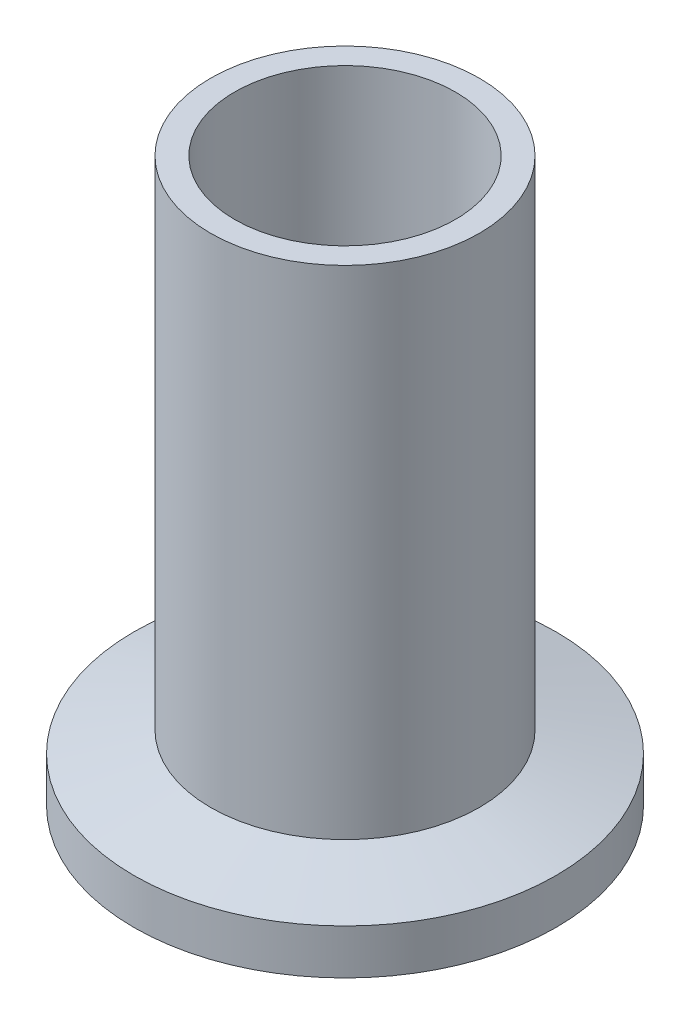
ISO-10303-21;
HEADER;
FILE_DESCRIPTION(('STEP AP214'),'2;1');
FILE_NAME('part.step','',(''),(''),'','','');
FILE_SCHEMA(('AUTOMOTIVE_DESIGN { 1 0 10303 214 1 1 1 1 }'));
ENDSEC;
DATA;
#1=APPLICATION_CONTEXT('core data for automotive mechanical design processes');
#2=APPLICATION_PROTOCOL_DEFINITION('international standard','automotive_design',2000,#1);
#3=PRODUCT_CONTEXT('',#1,'mechanical');
#4=PRODUCT('Part','Part','',(#3));
#5=PRODUCT_RELATED_PRODUCT_CATEGORY('part','',(#4));
#6=PRODUCT_DEFINITION_FORMATION('','',#4);
#7=PRODUCT_DEFINITION_CONTEXT('part definition',#1,'design');
#8=PRODUCT_DEFINITION('design','',#6,#7);
#9=PRODUCT_DEFINITION_SHAPE('','',#8);
#10=(LENGTH_UNIT() NAMED_UNIT(*) SI_UNIT(.MILLI.,.METRE.));
#11=(NAMED_UNIT(*) PLANE_ANGLE_UNIT() SI_UNIT($,.RADIAN.));
#12=(NAMED_UNIT(*) SI_UNIT($,.STERADIAN.) SOLID_ANGLE_UNIT());
#13=UNCERTAINTY_MEASURE_WITH_UNIT(LENGTH_MEASURE(1.E-05),#10,'distance_accuracy_value','');
#14=(GEOMETRIC_REPRESENTATION_CONTEXT(3) GLOBAL_UNCERTAINTY_ASSIGNED_CONTEXT((#13)) GLOBAL_UNIT_ASSIGNED_CONTEXT((#10,
#11,#12)) REPRESENTATION_CONTEXT('',''));
#15=CARTESIAN_POINT('',(0.,0.,0.));
#16=DIRECTION('',(0.,0.,1.));
#17=DIRECTION('',(1.,0.,0.));
#18=AXIS2_PLACEMENT_3D('',#15,#16,#17);
#19=CARTESIAN_POINT('',(0.,0.,8.1));
#20=DIRECTION('',(0.,1.,0.));
#21=DIRECTION('',(0.,0.,1.));
#22=AXIS2_PLACEMENT_3D('',#19,#20,#21);
#23=PLANE('',#22);
#24=CARTESIAN_POINT('',(0.,0.,0.));
#25=DIRECTION('',(0.,-1.,0.));
#26=DIRECTION('',(0.,0.,-1.));
#27=AXIS2_PLACEMENT_3D('',#24,#25,#26);
#28=CIRCLE('',#27,8.1);
#29=CARTESIAN_POINT('',(0.,0.,-8.1));
#30=VERTEX_POINT('',#29);
#31=EDGE_CURVE('E57',#30,#30,#28,.T.);
#32=ORIENTED_EDGE('',*,*,#31,.F.);
#33=EDGE_LOOP('',(#32));
#34=FACE_BOUND('',#33,.T.);
#35=CARTESIAN_POINT('',(0.,0.,0.));
#36=DIRECTION('',(0.,-1.,0.));
#37=DIRECTION('',(0.,0.,-1.));
#38=AXIS2_PLACEMENT_3D('',#35,#36,#37);
#39=CIRCLE('',#38,15.);
#40=CARTESIAN_POINT('',(0.,0.,-15.));
#41=VERTEX_POINT('',#40);
#42=EDGE_CURVE('E11',#41,#41,#39,.T.);
#43=ORIENTED_EDGE('',*,*,#42,.T.);
#44=EDGE_LOOP('',(#43));
#45=FACE_BOUND('',#44,.T.);
#46=ADVANCED_FACE('F41',(#34,#45),#23,.F.);
#47=CARTESIAN_POINT('',(0.,0.,0.));
#48=DIRECTION('',(0.,-1.,0.));
#49=DIRECTION('',(0.,0.,-1.));
#50=AXIS2_PLACEMENT_3D('',#47,#48,#49);
#51=CYLINDRICAL_SURFACE('',#50,15.);
#52=ORIENTED_EDGE('',*,*,#42,.F.);
#53=EDGE_LOOP('',(#52));
#54=FACE_BOUND('',#53,.T.);
#55=CARTESIAN_POINT('',(0.,3.2,0.));
#56=DIRECTION('',(0.,-1.,0.));
#57=DIRECTION('',(0.,0.,-1.));
#58=AXIS2_PLACEMENT_3D('',#55,#56,#57);
#59=CIRCLE('',#58,15.);
#60=CARTESIAN_POINT('',(0.,3.2,-15.));
#61=VERTEX_POINT('',#60);
#62=EDGE_CURVE('E48',#61,#61,#59,.T.);
#63=ORIENTED_EDGE('',*,*,#62,.T.);
#64=EDGE_LOOP('',(#63));
#65=FACE_BOUND('',#64,.T.);
#66=ADVANCED_FACE('F91',(#54,#65),#51,.T.);
#67=CARTESIAN_POINT('',(0.,5.4,0.));
#68=DIRECTION('',(0.,-1.,0.));
#69=DIRECTION('',(0.,0.,-1.));
#70=AXIS2_PLACEMENT_3D('',#67,#68,#69);
#71=CONICAL_SURFACE('',#70,6.78948822334837,1.30899693899575);
#72=CARTESIAN_POINT('',(0.,4.6603230987496,0.));
#73=DIRECTION('',(0.,-1.,0.));
#74=DIRECTION('',(0.,0.,-1.));
#75=AXIS2_PLACEMENT_3D('',#72,#73,#74);
#76=CIRCLE('',#75,9.55);
#77=CARTESIAN_POINT('',(0.,4.6603230987496,-9.55));
#78=VERTEX_POINT('',#77);
#79=EDGE_CURVE('E44',#78,#78,#76,.T.);
#80=ORIENTED_EDGE('',*,*,#79,.T.);
#81=EDGE_LOOP('',(#80));
#82=FACE_BOUND('',#81,.T.);
#83=ORIENTED_EDGE('',*,*,#62,.F.);
#84=EDGE_LOOP('',(#83));
#85=FACE_BOUND('',#84,.T.);
#86=ADVANCED_FACE('F87',(#82,#85),#71,.T.);
#87=CARTESIAN_POINT('',(0.,2.5,0.));
#88=DIRECTION('',(0.,1.,0.));
#89=DIRECTION('',(0.,0.,1.));
#90=AXIS2_PLACEMENT_3D('',#87,#88,#89);
#91=PLANE('',#90);
#92=CARTESIAN_POINT('',(0.,2.5,0.));
#93=DIRECTION('',(0.,1.,0.));
#94=DIRECTION('',(0.,0.,1.));
#95=AXIS2_PLACEMENT_3D('',#92,#93,#94);
#96=CIRCLE('',#95,7.85);
#97=CARTESIAN_POINT('',(0.,2.5,7.85));
#98=VERTEX_POINT('',#97);
#99=EDGE_CURVE('E63',#98,#98,#96,.T.);
#100=ORIENTED_EDGE('',*,*,#99,.T.);
#101=EDGE_LOOP('',(#100));
#102=FACE_BOUND('',#101,.T.);
#103=CARTESIAN_POINT('',(0.,2.5,0.));
#104=DIRECTION('',(0.,-1.,0.));
#105=DIRECTION('',(0.,0.,-1.));
#106=AXIS2_PLACEMENT_3D('',#103,#104,#105);
#107=CIRCLE('',#106,8.1);
#108=CARTESIAN_POINT('',(0.,2.5,-8.1));
#109=VERTEX_POINT('',#108);
#110=EDGE_CURVE('E52',#109,#109,#107,.T.);
#111=ORIENTED_EDGE('',*,*,#110,.T.);
#112=EDGE_LOOP('',(#111));
#113=FACE_BOUND('',#112,.T.);
#114=ADVANCED_FACE('F90',(#102,#113),#91,.F.);
#115=CARTESIAN_POINT('',(0.,0.,0.));
#116=DIRECTION('',(0.,-1.,0.));
#117=DIRECTION('',(0.,0.,-1.));
#118=AXIS2_PLACEMENT_3D('',#115,#116,#117);
#119=CYLINDRICAL_SURFACE('',#118,8.1);
#120=ORIENTED_EDGE('',*,*,#110,.F.);
#121=EDGE_LOOP('',(#120));
#122=FACE_BOUND('',#121,.T.);
#123=ORIENTED_EDGE('',*,*,#31,.T.);
#124=EDGE_LOOP('',(#123));
#125=FACE_BOUND('',#124,.T.);
#126=ADVANCED_FACE('F82',(#122,#125),#119,.F.);
#127=CARTESIAN_POINT('',(0.,107.011479041326,0.));
#128=DIRECTION('',(0.,-1.,0.));
#129=DIRECTION('',(0.,0.,-1.));
#130=AXIS2_PLACEMENT_3D('',#127,#128,#129);
#131=CYLINDRICAL_SURFACE('',#130,9.55);
#132=CARTESIAN_POINT('',(0.,40.,0.));
#133=DIRECTION('',(0.,1.,0.));
#134=DIRECTION('',(0.,0.,1.));
#135=AXIS2_PLACEMENT_3D('',#132,#133,#134);
#136=CIRCLE('',#135,9.55);
#137=CARTESIAN_POINT('',(0.,40.,-9.55));
#138=VERTEX_POINT('',#137);
#139=EDGE_CURVE('E60',#138,#138,#136,.F.);
#140=CARTESIAN_POINT('',(0.,40.,-9.55));
#141=CARTESIAN_POINT('',(0.,39.631878365612,-9.55));
#142=CARTESIAN_POINT('',(0.,39.2637567312239,-9.55));
#143=CARTESIAN_POINT('',(0.,38.5275134624479,-9.55));
#144=CARTESIAN_POINT('',(0.,38.1593918280599,-9.55));
#145=CARTESIAN_POINT('',(0.,37.4231485592838,-9.55));
#146=CARTESIAN_POINT('',(0.,37.0550269248958,-9.55));
#147=CARTESIAN_POINT('',(0.,36.3187836561197,-9.55));
#148=CARTESIAN_POINT('',(0.,35.9506620217317,-9.55));
#149=CARTESIAN_POINT('',(0.,35.2144187529557,-9.55));
#150=CARTESIAN_POINT('',(0.,34.8462971185676,-9.55));
#151=CARTESIAN_POINT('',(0.,34.1100538497916,-9.55));
#152=CARTESIAN_POINT('',(0.,33.7419322154036,-9.55));
#153=CARTESIAN_POINT('',(0.,33.0056889466275,-9.55));
#154=CARTESIAN_POINT('',(0.,32.6375673122395,-9.55));
#155=CARTESIAN_POINT('',(0.,31.9013240434634,-9.55));
#156=CARTESIAN_POINT('',(0.,31.5332024090754,-9.55));
#157=CARTESIAN_POINT('',(0.,30.7969591402994,-9.55));
#158=CARTESIAN_POINT('',(0.,30.4288375059113,-9.55));
#159=CARTESIAN_POINT('',(0.,29.6925942371353,-9.55));
#160=CARTESIAN_POINT('',(0.,29.3244726027473,-9.55));
#161=CARTESIAN_POINT('',(0.,28.5882293339712,-9.55));
#162=CARTESIAN_POINT('',(0.,28.2201076995832,-9.55));
#163=CARTESIAN_POINT('',(0.,27.4838644308071,-9.55));
#164=CARTESIAN_POINT('',(0.,27.1157427964191,-9.55));
#165=CARTESIAN_POINT('',(0.,26.3794995276431,-9.55));
#166=CARTESIAN_POINT('',(0.,26.0113778932551,-9.55));
#167=CARTESIAN_POINT('',(0.,25.275134624479,-9.55));
#168=CARTESIAN_POINT('',(0.,24.907012990091,-9.55));
#169=CARTESIAN_POINT('',(0.,24.1707697213149,-9.55));
#170=CARTESIAN_POINT('',(0.,23.8026480869269,-9.55));
#171=CARTESIAN_POINT('',(0.,23.0664048181508,-9.55));
#172=CARTESIAN_POINT('',(0.,22.6982831837628,-9.55));
#173=CARTESIAN_POINT('',(0.,21.9620399149868,-9.55));
#174=CARTESIAN_POINT('',(0.,21.5939182805988,-9.55));
#175=CARTESIAN_POINT('',(0.,20.8576750118227,-9.55));
#176=CARTESIAN_POINT('',(0.,20.4895533774347,-9.55));
#177=CARTESIAN_POINT('',(0.,19.7533101086586,-9.55));
#178=CARTESIAN_POINT('',(0.,19.3851884742706,-9.55));
#179=CARTESIAN_POINT('',(0.,18.6489452054945,-9.55));
#180=CARTESIAN_POINT('',(0.,18.2808235711065,-9.55));
#181=CARTESIAN_POINT('',(0.,17.5445803023305,-9.55));
#182=CARTESIAN_POINT('',(0.,17.1764586679425,-9.55));
#183=CARTESIAN_POINT('',(0.,16.4402153991664,-9.55));
#184=CARTESIAN_POINT('',(0.,16.0720937647784,-9.55));
#185=CARTESIAN_POINT('',(0.,15.3358504960023,-9.55));
#186=CARTESIAN_POINT('',(0.,14.9677288616143,-9.55));
#187=CARTESIAN_POINT('',(0.,14.2314855928382,-9.55));
#188=CARTESIAN_POINT('',(0.,13.8633639584502,-9.55));
#189=CARTESIAN_POINT('',(0.,13.1271206896742,-9.55));
#190=CARTESIAN_POINT('',(0.,12.7589990552862,-9.55));
#191=CARTESIAN_POINT('',(0.,12.0227557865101,-9.55));
#192=CARTESIAN_POINT('',(0.,11.6546341521221,-9.55));
#193=CARTESIAN_POINT('',(0.,10.918390883346,-9.55));
#194=CARTESIAN_POINT('',(0.,10.550269248958,-9.55));
#195=CARTESIAN_POINT('',(0.,9.81402598018195,-9.55));
#196=CARTESIAN_POINT('',(0.,9.44590434579392,-9.55));
#197=CARTESIAN_POINT('',(0.,8.70966107701788,-9.55));
#198=CARTESIAN_POINT('',(0.,8.34153944262985,-9.55));
#199=CARTESIAN_POINT('',(0.,7.6052961738538,-9.55));
#200=CARTESIAN_POINT('',(0.,7.23717453946578,-9.55));
#201=CARTESIAN_POINT('',(0.,6.50093127068972,-9.55));
#202=CARTESIAN_POINT('',(0.,6.13280963630169,-9.55));
#203=CARTESIAN_POINT('',(0.,5.39656636752565,-9.55));
#204=CARTESIAN_POINT('',(0.,5.02844473313762,-9.55));
#205=CARTESIAN_POINT('',(0.,4.6603230987496,-9.55));
#206=B_SPLINE_CURVE_WITH_KNOTS('',3,(#140,#141,#142,#143,#144,#145,#146,#147,#148,#149,#150,
#151,#152,#153,#154,#155,#156,#157,#158,#159,#160,#161,#162,#163,#164,#165,#166,#167,#168,#169,
#170,#171,#172,#173,#174,#175,#176,#177,#178,#179,#180,#181,#182,#183,#184,#185,#186,#187,#188,
#189,#190,#191,#192,#193,#194,#195,#196,#197,#198,#199,#200,#201,#202,#203,#204,#205),
.UNSPECIFIED.,.F.,.F.,(4,2,2,2,2,2,2,2,2,2,2,2,2,2,2,2,2,2,2,2,2,2,2,2,2,2,2,2,2,2,2,2,4),(0.,
1.10436490316407,2.20872980632815,3.31309470949223,4.4174596126563,5.52182451582037,
6.62618941898445,7.73055432214853,8.8349192253126,9.93928412847667,11.0436490316407,
12.1480139348048,13.2523788379689,14.356743741133,15.461108644297,16.5654735474611,
17.6698384506252,18.7742033537893,19.8785682569533,20.9829331601174,22.0872980632815,
23.1916629664456,24.2960278696096,25.4003927727737,26.5047576759378,27.6091225791019,
28.7134874822659,29.81785238543,30.9222172885941,32.0265821917582,33.1309470949222,
34.2353119980863,35.3396769012504),.UNSPECIFIED.);
#207=EDGE_CURVE('BSEAM76',#138,#78,#206,.T.);
#208=ORIENTED_EDGE('',*,*,#139,.T.);
#209=ORIENTED_EDGE('',*,*,#79,.F.);
#210=ORIENTED_EDGE('',*,*,#207,.T.);
#211=ORIENTED_EDGE('',*,*,#207,.F.);
#212=EDGE_LOOP('',(#208,#210,#209,#211));
#213=FACE_BOUND('',#212,.T.);
#214=ADVANCED_FACE('F76',(#213),#131,.T.);
#215=CARTESIAN_POINT('',(0.,40.,8.1));
#216=DIRECTION('',(0.,1.,0.));
#217=DIRECTION('',(0.,0.,1.));
#218=AXIS2_PLACEMENT_3D('',#215,#216,#217);
#219=PLANE('',#218);
#220=CARTESIAN_POINT('',(0.,40.,0.));
#221=DIRECTION('',(0.,1.,0.));
#222=DIRECTION('',(0.,0.,1.));
#223=AXIS2_PLACEMENT_3D('',#220,#221,#222);
#224=CIRCLE('',#223,7.85);
#225=CARTESIAN_POINT('',(0.,40.,7.85));
#226=VERTEX_POINT('',#225);
#227=EDGE_CURVE('E66',#226,#226,#224,.T.);
#228=ORIENTED_EDGE('',*,*,#227,.F.);
#229=EDGE_LOOP('',(#228));
#230=FACE_BOUND('',#229,.T.);
#231=ORIENTED_EDGE('',*,*,#139,.F.);
#232=EDGE_LOOP('',(#231));
#233=FACE_BOUND('',#232,.T.);
#234=ADVANCED_FACE('F73',(#230,#233),#219,.T.);
#235=CARTESIAN_POINT('',(0.,0.,0.));
#236=DIRECTION('',(0.,1.,0.));
#237=DIRECTION('',(0.,0.,1.));
#238=AXIS2_PLACEMENT_3D('',#235,#236,#237);
#239=CYLINDRICAL_SURFACE('',#238,7.85);
#240=ORIENTED_EDGE('',*,*,#227,.T.);
#241=EDGE_LOOP('',(#240));
#242=FACE_BOUND('',#241,.T.);
#243=ORIENTED_EDGE('',*,*,#99,.F.);
#244=EDGE_LOOP('',(#243));
#245=FACE_BOUND('',#244,.T.);
#246=ADVANCED_FACE('F70',(#242,#245),#239,.F.);
#247=CLOSED_SHELL('',(#46,#66,#86,#114,#126,#214,#234,#246));
#248=MANIFOLD_SOLID_BREP('B2',#247);
#249=ADVANCED_BREP_SHAPE_REPRESENTATION('',(#18,#248),#14);
#250=SHAPE_DEFINITION_REPRESENTATION(#9,#249);
ENDSEC;
END-ISO-10303-21;
